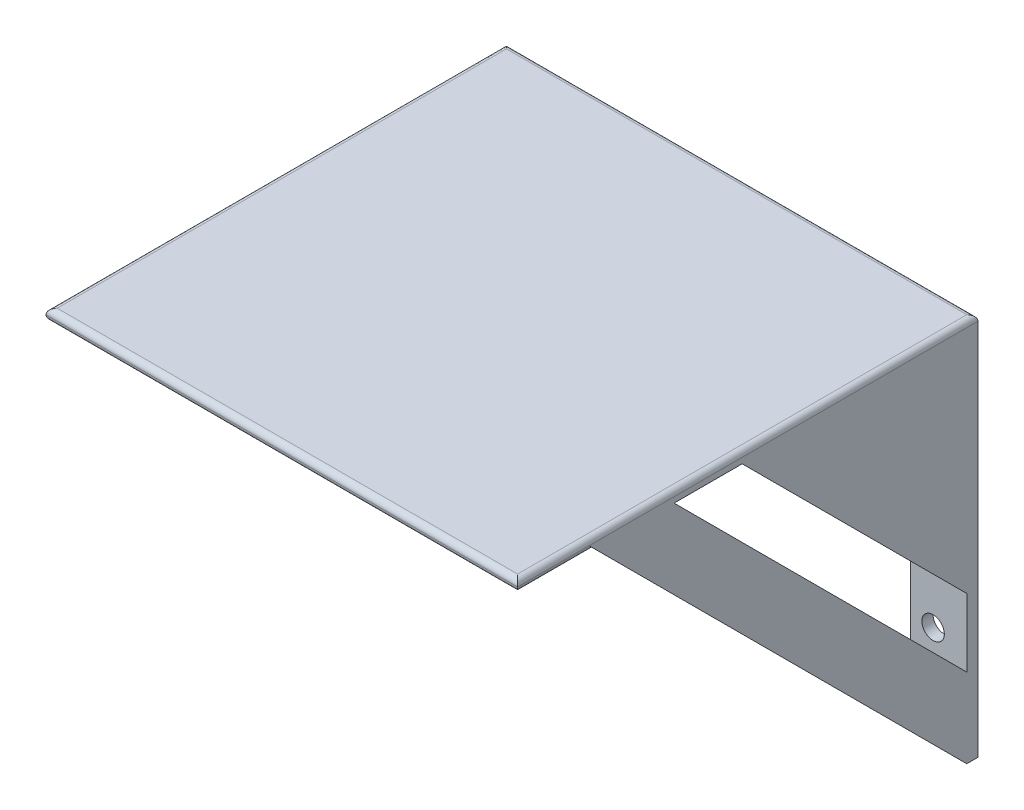
ISO-10303-21;
HEADER;
FILE_DESCRIPTION(('STEP AP214'),'2;1');
FILE_NAME('part.step','',(''),(''),'','','');
FILE_SCHEMA(('AUTOMOTIVE_DESIGN { 1 0 10303 214 1 1 1 1 }'));
ENDSEC;
DATA;
#1=APPLICATION_CONTEXT('core data for automotive mechanical design processes');
#2=APPLICATION_PROTOCOL_DEFINITION('international standard','automotive_design',2000,#1);
#3=PRODUCT_CONTEXT('',#1,'mechanical');
#4=PRODUCT('Part','Part','',(#3));
#5=PRODUCT_RELATED_PRODUCT_CATEGORY('part','',(#4));
#6=PRODUCT_DEFINITION_FORMATION('','',#4);
#7=PRODUCT_DEFINITION_CONTEXT('part definition',#1,'design');
#8=PRODUCT_DEFINITION('design','',#6,#7);
#9=PRODUCT_DEFINITION_SHAPE('','',#8);
#10=(LENGTH_UNIT() NAMED_UNIT(*) SI_UNIT(.MILLI.,.METRE.));
#11=(NAMED_UNIT(*) PLANE_ANGLE_UNIT() SI_UNIT($,.RADIAN.));
#12=(NAMED_UNIT(*) SI_UNIT($,.STERADIAN.) SOLID_ANGLE_UNIT());
#13=UNCERTAINTY_MEASURE_WITH_UNIT(LENGTH_MEASURE(1.E-05),#10,'distance_accuracy_value','');
#14=(GEOMETRIC_REPRESENTATION_CONTEXT(3) GLOBAL_UNCERTAINTY_ASSIGNED_CONTEXT((#13)) GLOBAL_UNIT_ASSIGNED_CONTEXT((#10,
#11,#12)) REPRESENTATION_CONTEXT('',''));
#15=CARTESIAN_POINT('',(0.,0.,0.));
#16=DIRECTION('',(0.,0.,1.));
#17=DIRECTION('',(1.,0.,0.));
#18=AXIS2_PLACEMENT_3D('',#15,#16,#17);
#19=CARTESIAN_POINT('',(0.,0.,3.175));
#20=DIRECTION('',(0.,0.,-1.));
#21=DIRECTION('',(-1.,0.,0.));
#22=AXIS2_PLACEMENT_3D('',#19,#20,#21);
#23=PLANE('',#22);
#24=CARTESIAN_POINT('',(-57.15,-25.612499956,3.175));
#25=DIRECTION('',(0.,0.,1.));
#26=DIRECTION('',(1.,0.,0.));
#27=AXIS2_PLACEMENT_3D('',#24,#25,#26);
#28=CIRCLE('',#27,3.175);
#29=CARTESIAN_POINT('',(-53.975,-25.612499956,3.175));
#30=VERTEX_POINT('',#29);
#31=EDGE_CURVE('E441',#30,#30,#28,.T.);
#32=ORIENTED_EDGE('',*,*,#31,.F.);
#33=EDGE_LOOP('',(#32));
#34=FACE_BOUND('',#33,.T.);
#35=CARTESIAN_POINT('',(-57.15,22.437499956,3.175));
#36=DIRECTION('',(0.,0.,1.));
#37=DIRECTION('',(1.,0.,0.));
#38=AXIS2_PLACEMENT_3D('',#35,#36,#37);
#39=CIRCLE('',#38,3.175);
#40=CARTESIAN_POINT('',(-53.975,22.437499956,3.175));
#41=VERTEX_POINT('',#40);
#42=EDGE_CURVE('E437',#41,#41,#39,.T.);
#43=ORIENTED_EDGE('',*,*,#42,.F.);
#44=EDGE_LOOP('',(#43));
#45=FACE_BOUND('',#44,.T.);
#46=CARTESIAN_POINT('',(-34.925,44.662499956,3.175));
#47=DIRECTION('',(0.,0.,1.));
#48=DIRECTION('',(1.,0.,0.));
#49=AXIS2_PLACEMENT_3D('',#46,#47,#48);
#50=CIRCLE('',#49,3.175);
#51=CARTESIAN_POINT('',(-31.75,44.662499956,3.175));
#52=VERTEX_POINT('',#51);
#53=EDGE_CURVE('E446',#52,#52,#50,.T.);
#54=ORIENTED_EDGE('',*,*,#53,.F.);
#55=EDGE_LOOP('',(#54));
#56=FACE_BOUND('',#55,.T.);
#57=CARTESIAN_POINT('',(34.925,44.662499956,3.175));
#58=DIRECTION('',(0.,0.,1.));
#59=DIRECTION('',(-1.,0.,0.));
#60=AXIS2_PLACEMENT_3D('',#57,#58,#59);
#61=CIRCLE('',#60,3.175);
#62=CARTESIAN_POINT('',(31.75,44.662499956,3.175));
#63=VERTEX_POINT('',#62);
#64=EDGE_CURVE('E454',#63,#63,#61,.T.);
#65=ORIENTED_EDGE('',*,*,#64,.F.);
#66=EDGE_LOOP('',(#65));
#67=FACE_BOUND('',#66,.T.);
#68=CARTESIAN_POINT('',(57.15,22.437499956,3.175));
#69=DIRECTION('',(0.,0.,1.));
#70=DIRECTION('',(-1.,0.,0.));
#71=AXIS2_PLACEMENT_3D('',#68,#69,#70);
#72=CIRCLE('',#71,3.175);
#73=CARTESIAN_POINT('',(53.975,22.437499956,3.175));
#74=VERTEX_POINT('',#73);
#75=EDGE_CURVE('E462',#74,#74,#72,.T.);
#76=ORIENTED_EDGE('',*,*,#75,.F.);
#77=EDGE_LOOP('',(#76));
#78=FACE_BOUND('',#77,.T.);
#79=CARTESIAN_POINT('',(57.15,-25.612499956,3.175));
#80=DIRECTION('',(0.,0.,1.));
#81=DIRECTION('',(-1.,0.,0.));
#82=AXIS2_PLACEMENT_3D('',#79,#80,#81);
#83=CIRCLE('',#82,3.175);
#84=CARTESIAN_POINT('',(53.975,-25.612499956,3.175));
#85=VERTEX_POINT('',#84);
#86=EDGE_CURVE('E470',#85,#85,#83,.T.);
#87=ORIENTED_EDGE('',*,*,#86,.F.);
#88=EDGE_LOOP('',(#87));
#89=FACE_BOUND('',#88,.T.);
#90=DIRECTION('',(0.,1.,0.));
#91=VECTOR('',#90,1.);
#92=CARTESIAN_POINT('',(66.675,-54.187499956,3.175));
#93=LINE('',#92,#91);
#94=CARTESIAN_POINT('',(66.675,-31.7368596533271,3.175));
#95=VERTEX_POINT('',#94);
#96=CARTESIAN_POINT('',(66.675,-12.487500044,3.175));
#97=VERTEX_POINT('',#96);
#98=EDGE_CURVE('E485',#95,#97,#93,.T.);
#99=ORIENTED_EDGE('',*,*,#98,.T.);
#100=DIRECTION('',(1.,0.,0.));
#101=VECTOR('',#100,1.);
#102=CARTESIAN_POINT('',(63.5,-12.487500044,3.175));
#103=LINE('',#102,#101);
#104=CARTESIAN_POINT('',(63.5,-12.487500044,3.175));
#105=VERTEX_POINT('',#104);
#106=EDGE_CURVE('E317',#105,#97,#103,.T.);
#107=ORIENTED_EDGE('',*,*,#106,.F.);
#108=DIRECTION('',(0.,1.,0.));
#109=VECTOR('',#108,1.);
#110=CARTESIAN_POINT('',(63.5,51.012499956,3.175));
#111=LINE('',#110,#109);
#112=CARTESIAN_POINT('',(63.5,51.012499956,3.175));
#113=VERTEX_POINT('',#112);
#114=EDGE_CURVE('E91',#105,#113,#111,.T.);
#115=ORIENTED_EDGE('',*,*,#114,.T.);
#116=DIRECTION('',(1.,0.,0.));
#117=VECTOR('',#116,1.);
#118=CARTESIAN_POINT('',(-66.675,51.012499956,3.175));
#119=LINE('',#118,#117);
#120=CARTESIAN_POINT('',(-63.5,51.012499956,3.175));
#121=VERTEX_POINT('',#120);
#122=EDGE_CURVE('E423',#121,#113,#119,.T.);
#123=ORIENTED_EDGE('',*,*,#122,.F.);
#124=DIRECTION('',(0.,-1.,0.));
#125=VECTOR('',#124,1.);
#126=CARTESIAN_POINT('',(-63.5,-12.487500044,3.175));
#127=LINE('',#126,#125);
#128=CARTESIAN_POINT('',(-63.5,-12.487500044,3.175));
#129=VERTEX_POINT('',#128);
#130=EDGE_CURVE('E405',#121,#129,#127,.T.);
#131=ORIENTED_EDGE('',*,*,#130,.T.);
#132=DIRECTION('',(-1.,0.,0.));
#133=VECTOR('',#132,1.);
#134=CARTESIAN_POINT('',(-63.5,-12.487500044,3.175));
#135=LINE('',#134,#133);
#136=CARTESIAN_POINT('',(-66.675,-12.487500044,3.175));
#137=VERTEX_POINT('',#136);
#138=EDGE_CURVE('E415',#129,#137,#135,.T.);
#139=ORIENTED_EDGE('',*,*,#138,.T.);
#140=DIRECTION('',(0.,-1.,0.));
#141=VECTOR('',#140,1.);
#142=CARTESIAN_POINT('',(-66.675,-54.187499956,3.175));
#143=LINE('',#142,#141);
#144=CARTESIAN_POINT('',(-66.675,-31.7368596533271,3.175));
#145=VERTEX_POINT('',#144);
#146=EDGE_CURVE('E489',#137,#145,#143,.T.);
#147=ORIENTED_EDGE('',*,*,#146,.T.);
#148=DIRECTION('',(-1.,0.,0.));
#149=VECTOR('',#148,1.);
#150=CARTESIAN_POINT('',(-63.5,-31.7368596533271,3.175));
#151=LINE('',#150,#149);
#152=CARTESIAN_POINT('',(-63.5,-31.7368596533271,3.175));
#153=VERTEX_POINT('',#152);
#154=EDGE_CURVE('E369',#153,#145,#151,.T.);
#155=ORIENTED_EDGE('',*,*,#154,.F.);
#156=DIRECTION('',(0.,-1.,0.));
#157=VECTOR('',#156,1.);
#158=CARTESIAN_POINT('',(-63.5,-31.7368596533271,3.175));
#159=LINE('',#158,#157);
#160=CARTESIAN_POINT('',(-63.5,-54.187499956,3.175));
#161=VERTEX_POINT('',#160);
#162=EDGE_CURVE('E390',#153,#161,#159,.T.);
#163=ORIENTED_EDGE('',*,*,#162,.T.);
#164=DIRECTION('',(1.,0.,0.));
#165=VECTOR('',#164,1.);
#166=CARTESIAN_POINT('',(-66.675,-54.187499956,3.175));
#167=LINE('',#166,#165);
#168=CARTESIAN_POINT('',(-50.8,-54.187499956,3.175));
#169=VERTEX_POINT('',#168);
#170=EDGE_CURVE('E493',#161,#169,#167,.T.);
#171=ORIENTED_EDGE('',*,*,#170,.T.);
#172=DIRECTION('',(0.,1.,0.));
#173=VECTOR('',#172,1.);
#174=CARTESIAN_POINT('',(-50.8,-54.187499956,3.175));
#175=LINE('',#174,#173);
#176=CARTESIAN_POINT('',(-50.8,12.912499956,3.175));
#177=VERTEX_POINT('',#176);
#178=EDGE_CURVE('E497',#169,#177,#175,.T.);
#179=ORIENTED_EDGE('',*,*,#178,.T.);
#180=DIRECTION('',(0.707106781186547,0.707106781186548,0.));
#181=VECTOR('',#180,1.);
#182=CARTESIAN_POINT('',(-50.8,12.912499956,3.175));
#183=LINE('',#182,#181);
#184=CARTESIAN_POINT('',(-25.4,38.312499956,3.175));
#185=VERTEX_POINT('',#184);
#186=EDGE_CURVE('E500',#177,#185,#183,.T.);
#187=ORIENTED_EDGE('',*,*,#186,.T.);
#188=DIRECTION('',(1.,0.,0.));
#189=VECTOR('',#188,1.);
#190=CARTESIAN_POINT('',(-25.4,38.312499956,3.175));
#191=LINE('',#190,#189);
#192=CARTESIAN_POINT('',(25.4,38.312499956,3.175));
#193=VERTEX_POINT('',#192);
#194=EDGE_CURVE('E503',#185,#193,#191,.T.);
#195=ORIENTED_EDGE('',*,*,#194,.T.);
#196=DIRECTION('',(0.707106781186548,-0.707106781186547,0.));
#197=VECTOR('',#196,1.);
#198=CARTESIAN_POINT('',(25.4,38.312499956,3.175));
#199=LINE('',#198,#197);
#200=CARTESIAN_POINT('',(50.8,12.912499956,3.175));
#201=VERTEX_POINT('',#200);
#202=EDGE_CURVE('E506',#193,#201,#199,.T.);
#203=ORIENTED_EDGE('',*,*,#202,.T.);
#204=DIRECTION('',(0.,-1.,0.));
#205=VECTOR('',#204,1.);
#206=CARTESIAN_POINT('',(50.8,12.912499956,3.175));
#207=LINE('',#206,#205);
#208=CARTESIAN_POINT('',(50.8,-54.187499956,3.175));
#209=VERTEX_POINT('',#208);
#210=EDGE_CURVE('E509',#201,#209,#207,.T.);
#211=ORIENTED_EDGE('',*,*,#210,.T.);
#212=DIRECTION('',(1.,0.,0.));
#213=VECTOR('',#212,1.);
#214=CARTESIAN_POINT('',(50.8,-54.187499956,3.175));
#215=LINE('',#214,#213);
#216=CARTESIAN_POINT('',(63.5,-54.187499956,3.175));
#217=VERTEX_POINT('',#216);
#218=EDGE_CURVE('E512',#209,#217,#215,.T.);
#219=ORIENTED_EDGE('',*,*,#218,.T.);
#220=DIRECTION('',(0.,1.,0.));
#221=VECTOR('',#220,1.);
#222=CARTESIAN_POINT('',(63.5,-54.187499956,3.175));
#223=LINE('',#222,#221);
#224=CARTESIAN_POINT('',(63.5,-31.7368596533271,3.175));
#225=VERTEX_POINT('',#224);
#226=EDGE_CURVE('E352',#217,#225,#223,.T.);
#227=ORIENTED_EDGE('',*,*,#226,.T.);
#228=DIRECTION('',(1.,0.,0.));
#229=VECTOR('',#228,1.);
#230=CARTESIAN_POINT('',(63.5,-31.7368596533271,3.175));
#231=LINE('',#230,#229);
#232=EDGE_CURVE('E370',#225,#95,#231,.T.);
#233=ORIENTED_EDGE('',*,*,#232,.T.);
#234=EDGE_LOOP('',(#99,#107,#115,#123,#131,#139,#147,#155,#163,#171,#179,#187,#195,#203,#211,
#219,#227,#233));
#235=FACE_BOUND('',#234,.T.);
#236=ADVANCED_FACE('F45',(#34,#45,#56,#67,#78,#89,#235),#23,.F.);
#237=CARTESIAN_POINT('',(66.675,-54.187499956,3.175));
#238=DIRECTION('',(-1.,0.,0.));
#239=DIRECTION('',(0.,0.,1.));
#240=AXIS2_PLACEMENT_3D('',#237,#238,#239);
#241=PLANE('',#240);
#242=ORIENTED_EDGE('',*,*,#98,.F.);
#243=DIRECTION('',(0.,0.707106781186548,0.707106781186547));
#244=VECTOR('',#243,1.);
#245=CARTESIAN_POINT('',(66.675,-31.7368596533271,3.175));
#246=LINE('',#245,#244);
#247=CARTESIAN_POINT('',(66.675,51.012499956,85.9243596093271));
#248=VERTEX_POINT('',#247);
#249=EDGE_CURVE('E348',#95,#248,#246,.T.);
#250=ORIENTED_EDGE('',*,*,#249,.T.);
#251=DIRECTION('',(0.,0.,-1.));
#252=VECTOR('',#251,1.);
#253=CARTESIAN_POINT('',(66.675,51.012499956,130.175));
#254=LINE('',#253,#252);
#255=CARTESIAN_POINT('',(66.675,51.012499956,66.675));
#256=VERTEX_POINT('',#255);
#257=EDGE_CURVE('E429',#248,#256,#254,.T.);
#258=ORIENTED_EDGE('',*,*,#257,.T.);
#259=DIRECTION('',(0.,-0.707106781186548,-0.707106781186548));
#260=VECTOR('',#259,1.);
#261=CARTESIAN_POINT('',(66.675,-12.487500044,3.175));
#262=LINE('',#261,#260);
#263=EDGE_CURVE('E331',#256,#97,#262,.T.);
#264=ORIENTED_EDGE('',*,*,#263,.T.);
#265=EDGE_LOOP('',(#242,#250,#258,#264));
#266=FACE_BOUND('',#265,.T.);
#267=DIRECTION('',(0.,1.,0.));
#268=VECTOR('',#267,1.);
#269=CARTESIAN_POINT('',(66.675,-54.187499956,0.));
#270=LINE('',#269,#268);
#271=CARTESIAN_POINT('',(66.675,-54.187499956,0.));
#272=VERTEX_POINT('',#271);
#273=CARTESIAN_POINT('',(66.675,52.599999956,0.));
#274=VERTEX_POINT('',#273);
#275=EDGE_CURVE('E481',#272,#274,#270,.T.);
#276=ORIENTED_EDGE('',*,*,#275,.T.);
#277=DIRECTION('',(0.,0.,-1.));
#278=VECTOR('',#277,1.);
#279=CARTESIAN_POINT('',(66.675,52.599999956,3.175));
#280=LINE('',#279,#278);
#281=CARTESIAN_POINT('',(66.675,52.599999956,109.962499912));
#282=VERTEX_POINT('',#281);
#283=EDGE_CURVE('E264',#274,#282,#280,.F.);
#284=ORIENTED_EDGE('',*,*,#283,.T.);
#285=DIRECTION('',(0.,-0.707106781186548,-0.707106781186548));
#286=VECTOR('',#285,1.);
#287=CARTESIAN_POINT('',(66.675,51.012499956,108.374999912));
#288=LINE('',#287,#286);
#289=CARTESIAN_POINT('',(66.675,-54.187499956,3.175));
#290=VERTEX_POINT('',#289);
#291=EDGE_CURVE('E334',#282,#290,#288,.T.);
#292=ORIENTED_EDGE('',*,*,#291,.T.);
#293=DIRECTION('',(0.,0.,-1.));
#294=VECTOR('',#293,1.);
#295=CARTESIAN_POINT('',(66.675,-54.187499956,3.175));
#296=LINE('',#295,#294);
#297=EDGE_CURVE('E516',#290,#272,#296,.T.);
#298=ORIENTED_EDGE('',*,*,#297,.T.);
#299=EDGE_LOOP('',(#276,#284,#292,#298));
#300=FACE_BOUND('',#299,.T.);
#301=ADVANCED_FACE('F594',(#266,#300),#241,.F.);
#302=CARTESIAN_POINT('',(-66.675,54.187499956,3.175));
#303=DIRECTION('',(0.,-1.,0.));
#304=DIRECTION('',(0.,0.,-1.));
#305=AXIS2_PLACEMENT_3D('',#302,#303,#304);
#306=PLANE('',#305);
#307=DIRECTION('',(-1.,0.,0.));
#308=VECTOR('',#307,1.);
#309=CARTESIAN_POINT('',(66.675,54.187499956,128.5875));
#310=LINE('',#309,#308);
#311=CARTESIAN_POINT('',(-65.0875,54.187499956,128.5875));
#312=VERTEX_POINT('',#311);
#313=CARTESIAN_POINT('',(65.0875,54.187499956,128.5875));
#314=VERTEX_POINT('',#313);
#315=EDGE_CURVE('E314',#312,#314,#310,.F.);
#316=ORIENTED_EDGE('',*,*,#315,.T.);
#317=DIRECTION('',(0.,0.,-1.));
#318=VECTOR('',#317,1.);
#319=CARTESIAN_POINT('',(65.0875,54.187499956,3.175));
#320=LINE('',#319,#318);
#321=CARTESIAN_POINT('',(65.0875,54.187499956,1.5875));
#322=VERTEX_POINT('',#321);
#323=EDGE_CURVE('E270',#314,#322,#320,.T.);
#324=ORIENTED_EDGE('',*,*,#323,.T.);
#325=DIRECTION('',(-1.,0.,0.));
#326=VECTOR('',#325,1.);
#327=CARTESIAN_POINT('',(-66.675,54.187499956,1.5875));
#328=LINE('',#327,#326);
#329=CARTESIAN_POINT('',(-65.0875,54.187499956,1.5875));
#330=VERTEX_POINT('',#329);
#331=EDGE_CURVE('E574',#322,#330,#328,.T.);
#332=ORIENTED_EDGE('',*,*,#331,.T.);
#333=DIRECTION('',(0.,0.,-1.));
#334=VECTOR('',#333,1.);
#335=CARTESIAN_POINT('',(-65.0875,54.187499956,3.175));
#336=LINE('',#335,#334);
#337=EDGE_CURVE('E577',#330,#312,#336,.F.);
#338=ORIENTED_EDGE('',*,*,#337,.T.);
#339=EDGE_LOOP('',(#316,#324,#332,#338));
#340=FACE_BOUND('',#339,.T.);
#341=ADVANCED_FACE('F583',(#340),#306,.F.);
#342=CARTESIAN_POINT('',(-66.675,-54.187499956,3.175));
#343=DIRECTION('',(1.,0.,0.));
#344=DIRECTION('',(0.,0.,-1.));
#345=AXIS2_PLACEMENT_3D('',#342,#343,#344);
#346=PLANE('',#345);
#347=DIRECTION('',(0.,0.707106781186548,0.707106781186548));
#348=VECTOR('',#347,1.);
#349=CARTESIAN_POINT('',(-66.675,51.012499956,108.374999912));
#350=LINE('',#349,#348);
#351=CARTESIAN_POINT('',(-66.675,-54.187499956,3.175));
#352=VERTEX_POINT('',#351);
#353=CARTESIAN_POINT('',(-66.675,52.599999956,109.962499912));
#354=VERTEX_POINT('',#353);
#355=EDGE_CURVE('E389',#352,#354,#350,.T.);
#356=ORIENTED_EDGE('',*,*,#355,.T.);
#357=DIRECTION('',(0.,0.,-1.));
#358=VECTOR('',#357,1.);
#359=CARTESIAN_POINT('',(-66.675,52.599999956,3.175));
#360=LINE('',#359,#358);
#361=CARTESIAN_POINT('',(-66.675,52.599999956,0.));
#362=VERTEX_POINT('',#361);
#363=EDGE_CURVE('E255',#354,#362,#360,.T.);
#364=ORIENTED_EDGE('',*,*,#363,.T.);
#365=DIRECTION('',(0.,-1.,0.));
#366=VECTOR('',#365,1.);
#367=CARTESIAN_POINT('',(-66.675,-54.187499956,0.));
#368=LINE('',#367,#366);
#369=CARTESIAN_POINT('',(-66.675,-54.187499956,0.));
#370=VERTEX_POINT('',#369);
#371=EDGE_CURVE('E520',#362,#370,#368,.T.);
#372=ORIENTED_EDGE('',*,*,#371,.T.);
#373=DIRECTION('',(0.,0.,-1.));
#374=VECTOR('',#373,1.);
#375=CARTESIAN_POINT('',(-66.675,-54.187499956,3.175));
#376=LINE('',#375,#374);
#377=EDGE_CURVE('E570',#352,#370,#376,.T.);
#378=ORIENTED_EDGE('',*,*,#377,.F.);
#379=EDGE_LOOP('',(#356,#364,#372,#378));
#380=FACE_BOUND('',#379,.T.);
#381=ORIENTED_EDGE('',*,*,#146,.F.);
#382=DIRECTION('',(0.,0.707106781186548,0.707106781186548));
#383=VECTOR('',#382,1.);
#384=CARTESIAN_POINT('',(-66.675,-12.487500044,3.175));
#385=LINE('',#384,#383);
#386=CARTESIAN_POINT('',(-66.675,51.012499956,66.675));
#387=VERTEX_POINT('',#386);
#388=EDGE_CURVE('E393',#137,#387,#385,.T.);
#389=ORIENTED_EDGE('',*,*,#388,.T.);
#390=DIRECTION('',(0.,0.,-1.));
#391=VECTOR('',#390,1.);
#392=CARTESIAN_POINT('',(-66.675,51.012499956,130.175));
#393=LINE('',#392,#391);
#394=CARTESIAN_POINT('',(-66.675,51.012499956,85.9243596093271));
#395=VERTEX_POINT('',#394);
#396=EDGE_CURVE('E433',#395,#387,#393,.T.);
#397=ORIENTED_EDGE('',*,*,#396,.F.);
#398=DIRECTION('',(0.,-0.707106781186548,-0.707106781186547));
#399=VECTOR('',#398,1.);
#400=CARTESIAN_POINT('',(-66.675,-31.7368596533271,3.175));
#401=LINE('',#400,#399);
#402=EDGE_CURVE('E385',#395,#145,#401,.T.);
#403=ORIENTED_EDGE('',*,*,#402,.T.);
#404=EDGE_LOOP('',(#381,#389,#397,#403));
#405=FACE_BOUND('',#404,.T.);
#406=ADVANCED_FACE('F628',(#380,#405),#346,.F.);
#407=CARTESIAN_POINT('',(-66.675,-54.187499956,3.175));
#408=DIRECTION('',(0.,1.,0.));
#409=DIRECTION('',(-1.,0.,0.));
#410=AXIS2_PLACEMENT_3D('',#407,#408,#409);
#411=PLANE('',#410);
#412=DIRECTION('',(1.,0.,0.));
#413=VECTOR('',#412,1.);
#414=CARTESIAN_POINT('',(-66.675,-54.187499956,0.));
#415=LINE('',#414,#413);
#416=CARTESIAN_POINT('',(-50.8,-54.187499956,0.));
#417=VERTEX_POINT('',#416);
#418=EDGE_CURVE('E523',#370,#417,#415,.T.);
#419=ORIENTED_EDGE('',*,*,#418,.T.);
#420=DIRECTION('',(0.,0.,-1.));
#421=VECTOR('',#420,1.);
#422=CARTESIAN_POINT('',(-50.8,-54.187499956,3.175));
#423=LINE('',#422,#421);
#424=EDGE_CURVE('E566',#169,#417,#423,.T.);
#425=ORIENTED_EDGE('',*,*,#424,.F.);
#426=ORIENTED_EDGE('',*,*,#170,.F.);
#427=EDGE_CURVE('E494',#352,#161,#167,.T.);
#428=ORIENTED_EDGE('',*,*,#427,.F.);
#429=ORIENTED_EDGE('',*,*,#377,.T.);
#430=EDGE_LOOP('',(#419,#425,#426,#428,#429));
#431=FACE_BOUND('',#430,.T.);
#432=ADVANCED_FACE('F685',(#431),#411,.F.);
#433=CARTESIAN_POINT('',(-50.8,-54.187499956,3.175));
#434=DIRECTION('',(-1.,0.,0.));
#435=DIRECTION('',(0.,0.,1.));
#436=AXIS2_PLACEMENT_3D('',#433,#434,#435);
#437=PLANE('',#436);
#438=DIRECTION('',(0.,1.,0.));
#439=VECTOR('',#438,1.);
#440=CARTESIAN_POINT('',(-50.8,-54.187499956,0.));
#441=LINE('',#440,#439);
#442=CARTESIAN_POINT('',(-50.8,12.912499956,0.));
#443=VERTEX_POINT('',#442);
#444=EDGE_CURVE('E526',#417,#443,#441,.T.);
#445=ORIENTED_EDGE('',*,*,#444,.T.);
#446=DIRECTION('',(0.,0.,-1.));
#447=VECTOR('',#446,1.);
#448=CARTESIAN_POINT('',(-50.8,12.912499956,3.175));
#449=LINE('',#448,#447);
#450=EDGE_CURVE('E562',#177,#443,#449,.T.);
#451=ORIENTED_EDGE('',*,*,#450,.F.);
#452=ORIENTED_EDGE('',*,*,#178,.F.);
#453=ORIENTED_EDGE('',*,*,#424,.T.);
#454=EDGE_LOOP('',(#445,#451,#452,#453));
#455=FACE_BOUND('',#454,.T.);
#456=ADVANCED_FACE('F681',(#455),#437,.F.);
#457=CARTESIAN_POINT('',(-50.8,12.912499956,3.175));
#458=DIRECTION('',(-0.707106781186548,0.707106781186547,0.));
#459=DIRECTION('',(-0.707106781186547,-0.707106781186548,0.));
#460=AXIS2_PLACEMENT_3D('',#457,#458,#459);
#461=PLANE('',#460);
#462=DIRECTION('',(0.707106781186547,0.707106781186548,0.));
#463=VECTOR('',#462,1.);
#464=CARTESIAN_POINT('',(-50.8,12.912499956,0.));
#465=LINE('',#464,#463);
#466=CARTESIAN_POINT('',(-25.4,38.312499956,0.));
#467=VERTEX_POINT('',#466);
#468=EDGE_CURVE('E529',#443,#467,#465,.T.);
#469=ORIENTED_EDGE('',*,*,#468,.T.);
#470=DIRECTION('',(0.,0.,-1.));
#471=VECTOR('',#470,1.);
#472=CARTESIAN_POINT('',(-25.4,38.312499956,3.175));
#473=LINE('',#472,#471);
#474=EDGE_CURVE('E558',#185,#467,#473,.T.);
#475=ORIENTED_EDGE('',*,*,#474,.F.);
#476=ORIENTED_EDGE('',*,*,#186,.F.);
#477=ORIENTED_EDGE('',*,*,#450,.T.);
#478=EDGE_LOOP('',(#469,#475,#476,#477));
#479=FACE_BOUND('',#478,.T.);
#480=ADVANCED_FACE('F677',(#479),#461,.F.);
#481=CARTESIAN_POINT('',(-25.4,38.312499956,3.175));
#482=DIRECTION('',(0.,1.,0.));
#483=DIRECTION('',(0.,0.,1.));
#484=AXIS2_PLACEMENT_3D('',#481,#482,#483);
#485=PLANE('',#484);
#486=DIRECTION('',(1.,0.,0.));
#487=VECTOR('',#486,1.);
#488=CARTESIAN_POINT('',(-25.4,38.312499956,0.));
#489=LINE('',#488,#487);
#490=CARTESIAN_POINT('',(25.4,38.312499956,0.));
#491=VERTEX_POINT('',#490);
#492=EDGE_CURVE('E532',#467,#491,#489,.T.);
#493=ORIENTED_EDGE('',*,*,#492,.T.);
#494=DIRECTION('',(0.,0.,-1.));
#495=VECTOR('',#494,1.);
#496=CARTESIAN_POINT('',(25.4,38.312499956,3.175));
#497=LINE('',#496,#495);
#498=EDGE_CURVE('E554',#193,#491,#497,.T.);
#499=ORIENTED_EDGE('',*,*,#498,.F.);
#500=ORIENTED_EDGE('',*,*,#194,.F.);
#501=ORIENTED_EDGE('',*,*,#474,.T.);
#502=EDGE_LOOP('',(#493,#499,#500,#501));
#503=FACE_BOUND('',#502,.T.);
#504=ADVANCED_FACE('F673',(#503),#485,.F.);
#505=CARTESIAN_POINT('',(25.4,38.312499956,3.175));
#506=DIRECTION('',(0.707106781186547,0.707106781186548,0.));
#507=DIRECTION('',(-0.707106781186548,0.707106781186547,0.));
#508=AXIS2_PLACEMENT_3D('',#505,#506,#507);
#509=PLANE('',#508);
#510=DIRECTION('',(0.707106781186548,-0.707106781186547,0.));
#511=VECTOR('',#510,1.);
#512=CARTESIAN_POINT('',(25.4,38.312499956,0.));
#513=LINE('',#512,#511);
#514=CARTESIAN_POINT('',(50.8,12.912499956,0.));
#515=VERTEX_POINT('',#514);
#516=EDGE_CURVE('E535',#491,#515,#513,.T.);
#517=ORIENTED_EDGE('',*,*,#516,.T.);
#518=DIRECTION('',(0.,0.,-1.));
#519=VECTOR('',#518,1.);
#520=CARTESIAN_POINT('',(50.8,12.912499956,3.175));
#521=LINE('',#520,#519);
#522=EDGE_CURVE('E550',#201,#515,#521,.T.);
#523=ORIENTED_EDGE('',*,*,#522,.F.);
#524=ORIENTED_EDGE('',*,*,#202,.F.);
#525=ORIENTED_EDGE('',*,*,#498,.T.);
#526=EDGE_LOOP('',(#517,#523,#524,#525));
#527=FACE_BOUND('',#526,.T.);
#528=ADVANCED_FACE('F669',(#527),#509,.F.);
#529=CARTESIAN_POINT('',(50.8,12.912499956,3.175));
#530=DIRECTION('',(1.,0.,0.));
#531=DIRECTION('',(0.,1.,0.));
#532=AXIS2_PLACEMENT_3D('',#529,#530,#531);
#533=PLANE('',#532);
#534=DIRECTION('',(0.,-1.,0.));
#535=VECTOR('',#534,1.);
#536=CARTESIAN_POINT('',(50.8,12.912499956,0.));
#537=LINE('',#536,#535);
#538=CARTESIAN_POINT('',(50.8,-54.187499956,0.));
#539=VERTEX_POINT('',#538);
#540=EDGE_CURVE('E538',#515,#539,#537,.T.);
#541=ORIENTED_EDGE('',*,*,#540,.T.);
#542=DIRECTION('',(0.,0.,-1.));
#543=VECTOR('',#542,1.);
#544=CARTESIAN_POINT('',(50.8,-54.187499956,3.175));
#545=LINE('',#544,#543);
#546=EDGE_CURVE('E546',#209,#539,#545,.T.);
#547=ORIENTED_EDGE('',*,*,#546,.F.);
#548=ORIENTED_EDGE('',*,*,#210,.F.);
#549=ORIENTED_EDGE('',*,*,#522,.T.);
#550=EDGE_LOOP('',(#541,#547,#548,#549));
#551=FACE_BOUND('',#550,.T.);
#552=ADVANCED_FACE('F666',(#551),#533,.F.);
#553=CARTESIAN_POINT('',(50.8,-54.187499956,3.175));
#554=DIRECTION('',(0.,1.,0.));
#555=DIRECTION('',(-1.,0.,0.));
#556=AXIS2_PLACEMENT_3D('',#553,#554,#555);
#557=PLANE('',#556);
#558=DIRECTION('',(1.,0.,0.));
#559=VECTOR('',#558,1.);
#560=CARTESIAN_POINT('',(50.8,-54.187499956,0.));
#561=LINE('',#560,#559);
#562=EDGE_CURVE('E490',#539,#272,#561,.T.);
#563=ORIENTED_EDGE('',*,*,#562,.T.);
#564=ORIENTED_EDGE('',*,*,#297,.F.);
#565=DIRECTION('',(1.,0.,0.));
#566=VECTOR('',#565,1.);
#567=CARTESIAN_POINT('',(63.5,-54.187499956,3.175));
#568=LINE('',#567,#566);
#569=EDGE_CURVE('E373',#217,#290,#568,.T.);
#570=ORIENTED_EDGE('',*,*,#569,.F.);
#571=ORIENTED_EDGE('',*,*,#218,.F.);
#572=ORIENTED_EDGE('',*,*,#546,.T.);
#573=EDGE_LOOP('',(#563,#564,#570,#571,#572));
#574=FACE_BOUND('',#573,.T.);
#575=ADVANCED_FACE('F596',(#574),#557,.F.);
#576=CARTESIAN_POINT('',(0.,0.,0.));
#577=DIRECTION('',(0.,0.,-1.));
#578=DIRECTION('',(-1.,0.,0.));
#579=AXIS2_PLACEMENT_3D('',#576,#577,#578);
#580=PLANE('',#579);
#581=CARTESIAN_POINT('',(57.15,-25.612499956,0.));
#582=DIRECTION('',(0.,0.,1.));
#583=DIRECTION('',(-1.,0.,0.));
#584=AXIS2_PLACEMENT_3D('',#581,#582,#583);
#585=CIRCLE('',#584,3.175);
#586=CARTESIAN_POINT('',(53.975,-25.612499956,0.));
#587=VERTEX_POINT('',#586);
#588=EDGE_CURVE('E436',#587,#587,#585,.T.);
#589=ORIENTED_EDGE('',*,*,#588,.T.);
#590=EDGE_LOOP('',(#589));
#591=FACE_BOUND('',#590,.T.);
#592=CARTESIAN_POINT('',(57.15,22.437499956,0.));
#593=DIRECTION('',(0.,0.,1.));
#594=DIRECTION('',(-1.,0.,0.));
#595=AXIS2_PLACEMENT_3D('',#592,#593,#594);
#596=CIRCLE('',#595,3.175);
#597=CARTESIAN_POINT('',(53.975,22.437499956,0.));
#598=VERTEX_POINT('',#597);
#599=EDGE_CURVE('E466',#598,#598,#596,.T.);
#600=ORIENTED_EDGE('',*,*,#599,.T.);
#601=EDGE_LOOP('',(#600));
#602=FACE_BOUND('',#601,.T.);
#603=CARTESIAN_POINT('',(34.925,44.662499956,0.));
#604=DIRECTION('',(0.,0.,1.));
#605=DIRECTION('',(-1.,0.,0.));
#606=AXIS2_PLACEMENT_3D('',#603,#604,#605);
#607=CIRCLE('',#606,3.175);
#608=CARTESIAN_POINT('',(31.75,44.662499956,0.));
#609=VERTEX_POINT('',#608);
#610=EDGE_CURVE('E458',#609,#609,#607,.T.);
#611=ORIENTED_EDGE('',*,*,#610,.T.);
#612=EDGE_LOOP('',(#611));
#613=FACE_BOUND('',#612,.T.);
#614=CARTESIAN_POINT('',(-34.925,44.662499956,0.));
#615=DIRECTION('',(0.,0.,1.));
#616=DIRECTION('',(1.,0.,0.));
#617=AXIS2_PLACEMENT_3D('',#614,#615,#616);
#618=CIRCLE('',#617,3.175);
#619=CARTESIAN_POINT('',(-31.75,44.662499956,0.));
#620=VERTEX_POINT('',#619);
#621=EDGE_CURVE('E450',#620,#620,#618,.T.);
#622=ORIENTED_EDGE('',*,*,#621,.T.);
#623=EDGE_LOOP('',(#622));
#624=FACE_BOUND('',#623,.T.);
#625=CARTESIAN_POINT('',(-57.15,22.437499956,0.));
#626=DIRECTION('',(0.,0.,1.));
#627=DIRECTION('',(1.,0.,0.));
#628=AXIS2_PLACEMENT_3D('',#625,#626,#627);
#629=CIRCLE('',#628,3.175);
#630=CARTESIAN_POINT('',(-53.975,22.437499956,0.));
#631=VERTEX_POINT('',#630);
#632=EDGE_CURVE('E442',#631,#631,#629,.T.);
#633=ORIENTED_EDGE('',*,*,#632,.T.);
#634=EDGE_LOOP('',(#633));
#635=FACE_BOUND('',#634,.T.);
#636=CARTESIAN_POINT('',(-57.15,-25.612499956,0.));
#637=DIRECTION('',(0.,0.,1.));
#638=DIRECTION('',(1.,0.,0.));
#639=AXIS2_PLACEMENT_3D('',#636,#637,#638);
#640=CIRCLE('',#639,3.175);
#641=CARTESIAN_POINT('',(-53.975,-25.612499956,0.));
#642=VERTEX_POINT('',#641);
#643=EDGE_CURVE('E477',#642,#642,#640,.T.);
#644=ORIENTED_EDGE('',*,*,#643,.T.);
#645=EDGE_LOOP('',(#644));
#646=FACE_BOUND('',#645,.T.);
#647=ORIENTED_EDGE('',*,*,#371,.F.);
#648=DIRECTION('',(-1.,0.,0.));
#649=VECTOR('',#648,1.);
#650=CARTESIAN_POINT('',(66.675,52.599999956,0.));
#651=LINE('',#650,#649);
#652=EDGE_CURVE('E236',#362,#274,#651,.F.);
#653=ORIENTED_EDGE('',*,*,#652,.T.);
#654=ORIENTED_EDGE('',*,*,#275,.F.);
#655=ORIENTED_EDGE('',*,*,#562,.F.);
#656=ORIENTED_EDGE('',*,*,#540,.F.);
#657=ORIENTED_EDGE('',*,*,#516,.F.);
#658=ORIENTED_EDGE('',*,*,#492,.F.);
#659=ORIENTED_EDGE('',*,*,#468,.F.);
#660=ORIENTED_EDGE('',*,*,#444,.F.);
#661=ORIENTED_EDGE('',*,*,#418,.F.);
#662=EDGE_LOOP('',(#647,#653,#654,#655,#656,#657,#658,#659,#660,#661));
#663=FACE_BOUND('',#662,.T.);
#664=ADVANCED_FACE('F590',(#591,#602,#613,#624,#635,#646,#663),#580,.T.);
#665=CARTESIAN_POINT('',(-57.15,-25.612499956,0.));
#666=DIRECTION('',(0.,0.,1.));
#667=DIRECTION('',(1.,0.,0.));
#668=AXIS2_PLACEMENT_3D('',#665,#666,#667);
#669=CYLINDRICAL_SURFACE('',#668,3.175);
#670=ORIENTED_EDGE('',*,*,#643,.F.);
#671=EDGE_LOOP('',(#670));
#672=FACE_BOUND('',#671,.T.);
#673=ORIENTED_EDGE('',*,*,#31,.T.);
#674=EDGE_LOOP('',(#673));
#675=FACE_BOUND('',#674,.T.);
#676=ADVANCED_FACE('F660',(#672,#675),#669,.F.);
#677=CARTESIAN_POINT('',(-57.15,22.437499956,0.));
#678=DIRECTION('',(0.,0.,1.));
#679=DIRECTION('',(1.,0.,0.));
#680=AXIS2_PLACEMENT_3D('',#677,#678,#679);
#681=CYLINDRICAL_SURFACE('',#680,3.175);
#682=ORIENTED_EDGE('',*,*,#632,.F.);
#683=EDGE_LOOP('',(#682));
#684=FACE_BOUND('',#683,.T.);
#685=ORIENTED_EDGE('',*,*,#42,.T.);
#686=EDGE_LOOP('',(#685));
#687=FACE_BOUND('',#686,.T.);
#688=ADVANCED_FACE('F730',(#684,#687),#681,.F.);
#689=CARTESIAN_POINT('',(-34.925,44.662499956,0.));
#690=DIRECTION('',(0.,0.,1.));
#691=DIRECTION('',(1.,0.,0.));
#692=AXIS2_PLACEMENT_3D('',#689,#690,#691);
#693=CYLINDRICAL_SURFACE('',#692,3.175);
#694=ORIENTED_EDGE('',*,*,#621,.F.);
#695=EDGE_LOOP('',(#694));
#696=FACE_BOUND('',#695,.T.);
#697=ORIENTED_EDGE('',*,*,#53,.T.);
#698=EDGE_LOOP('',(#697));
#699=FACE_BOUND('',#698,.T.);
#700=ADVANCED_FACE('F733',(#696,#699),#693,.F.);
#701=CARTESIAN_POINT('',(34.925,44.662499956,0.));
#702=DIRECTION('',(0.,0.,1.));
#703=DIRECTION('',(1.,0.,0.));
#704=AXIS2_PLACEMENT_3D('',#701,#702,#703);
#705=CYLINDRICAL_SURFACE('',#704,3.175);
#706=ORIENTED_EDGE('',*,*,#610,.F.);
#707=EDGE_LOOP('',(#706));
#708=FACE_BOUND('',#707,.T.);
#709=ORIENTED_EDGE('',*,*,#64,.T.);
#710=EDGE_LOOP('',(#709));
#711=FACE_BOUND('',#710,.T.);
#712=ADVANCED_FACE('F737',(#708,#711),#705,.F.);
#713=CARTESIAN_POINT('',(57.15,22.437499956,0.));
#714=DIRECTION('',(0.,0.,1.));
#715=DIRECTION('',(1.,0.,0.));
#716=AXIS2_PLACEMENT_3D('',#713,#714,#715);
#717=CYLINDRICAL_SURFACE('',#716,3.175);
#718=ORIENTED_EDGE('',*,*,#599,.F.);
#719=EDGE_LOOP('',(#718));
#720=FACE_BOUND('',#719,.T.);
#721=ORIENTED_EDGE('',*,*,#75,.T.);
#722=EDGE_LOOP('',(#721));
#723=FACE_BOUND('',#722,.T.);
#724=ADVANCED_FACE('F741',(#720,#723),#717,.F.);
#725=CARTESIAN_POINT('',(57.15,-25.612499956,0.));
#726=DIRECTION('',(0.,0.,1.));
#727=DIRECTION('',(1.,0.,0.));
#728=AXIS2_PLACEMENT_3D('',#725,#726,#727);
#729=CYLINDRICAL_SURFACE('',#728,3.175);
#730=ORIENTED_EDGE('',*,*,#588,.F.);
#731=EDGE_LOOP('',(#730));
#732=FACE_BOUND('',#731,.T.);
#733=ORIENTED_EDGE('',*,*,#86,.T.);
#734=EDGE_LOOP('',(#733));
#735=FACE_BOUND('',#734,.T.);
#736=ADVANCED_FACE('F729',(#732,#735),#729,.F.);
#737=CARTESIAN_POINT('',(-66.675,51.012499956,130.175));
#738=DIRECTION('',(0.,1.,0.));
#739=DIRECTION('',(0.,0.,1.));
#740=AXIS2_PLACEMENT_3D('',#737,#738,#739);
#741=PLANE('',#740);
#742=DIRECTION('',(1.,0.,0.));
#743=VECTOR('',#742,1.);
#744=CARTESIAN_POINT('',(63.5,51.012499956,108.374999912));
#745=LINE('',#744,#743);
#746=CARTESIAN_POINT('',(63.5,51.012499956,108.374999912));
#747=VERTEX_POINT('',#746);
#748=CARTESIAN_POINT('',(65.0875,51.012499956,108.374999912));
#749=VERTEX_POINT('',#748);
#750=EDGE_CURVE('E359',#747,#749,#745,.T.);
#751=ORIENTED_EDGE('',*,*,#750,.T.);
#752=DIRECTION('',(0.,0.,-1.));
#753=VECTOR('',#752,1.);
#754=CARTESIAN_POINT('',(65.0875,51.012499956,130.175));
#755=LINE('',#754,#753);
#756=CARTESIAN_POINT('',(65.0875,51.012499956,128.5875));
#757=VERTEX_POINT('',#756);
#758=EDGE_CURVE('E65',#749,#757,#755,.F.);
#759=ORIENTED_EDGE('',*,*,#758,.T.);
#760=DIRECTION('',(1.,0.,0.));
#761=VECTOR('',#760,1.);
#762=CARTESIAN_POINT('',(-66.675,51.012499956,128.5875));
#763=LINE('',#762,#761);
#764=CARTESIAN_POINT('',(-65.0875,51.012499956,128.5875));
#765=VERTEX_POINT('',#764);
#766=EDGE_CURVE('E233',#757,#765,#763,.F.);
#767=ORIENTED_EDGE('',*,*,#766,.T.);
#768=DIRECTION('',(0.,0.,-1.));
#769=VECTOR('',#768,1.);
#770=CARTESIAN_POINT('',(-65.0875,51.012499956,130.175));
#771=LINE('',#770,#769);
#772=CARTESIAN_POINT('',(-65.0875,51.012499956,108.374999912));
#773=VERTEX_POINT('',#772);
#774=EDGE_CURVE('E228',#765,#773,#771,.T.);
#775=ORIENTED_EDGE('',*,*,#774,.T.);
#776=DIRECTION('',(-1.,0.,0.));
#777=VECTOR('',#776,1.);
#778=CARTESIAN_POINT('',(-63.5,51.012499956,108.374999912));
#779=LINE('',#778,#777);
#780=CARTESIAN_POINT('',(-63.5,51.012499956,108.374999912));
#781=VERTEX_POINT('',#780);
#782=EDGE_CURVE('E231',#781,#773,#779,.T.);
#783=ORIENTED_EDGE('',*,*,#782,.F.);
#784=DIRECTION('',(0.,0.,-1.));
#785=VECTOR('',#784,1.);
#786=CARTESIAN_POINT('',(-63.5,51.012499956,85.9243596093271));
#787=LINE('',#786,#785);
#788=CARTESIAN_POINT('',(-63.5,51.012499956,85.9243596093271));
#789=VERTEX_POINT('',#788);
#790=EDGE_CURVE('E397',#781,#789,#787,.T.);
#791=ORIENTED_EDGE('',*,*,#790,.T.);
#792=DIRECTION('',(-1.,0.,0.));
#793=VECTOR('',#792,1.);
#794=CARTESIAN_POINT('',(-63.5,51.012499956,85.9243596093271));
#795=LINE('',#794,#793);
#796=EDGE_CURVE('E247',#789,#395,#795,.T.);
#797=ORIENTED_EDGE('',*,*,#796,.T.);
#798=ORIENTED_EDGE('',*,*,#396,.T.);
#799=DIRECTION('',(-1.,0.,0.));
#800=VECTOR('',#799,1.);
#801=CARTESIAN_POINT('',(-63.5,51.012499956,66.675));
#802=LINE('',#801,#800);
#803=CARTESIAN_POINT('',(-63.5,51.012499956,66.675));
#804=VERTEX_POINT('',#803);
#805=EDGE_CURVE('E419',#804,#387,#802,.T.);
#806=ORIENTED_EDGE('',*,*,#805,.F.);
#807=DIRECTION('',(0.,0.,-1.));
#808=VECTOR('',#807,1.);
#809=CARTESIAN_POINT('',(-63.5,51.012499956,3.175));
#810=LINE('',#809,#808);
#811=EDGE_CURVE('E412',#804,#121,#810,.T.);
#812=ORIENTED_EDGE('',*,*,#811,.T.);
#813=ORIENTED_EDGE('',*,*,#122,.T.);
#814=DIRECTION('',(0.,0.,1.));
#815=VECTOR('',#814,1.);
#816=CARTESIAN_POINT('',(63.5,51.012499956,66.675));
#817=LINE('',#816,#815);
#818=CARTESIAN_POINT('',(63.5,51.012499956,66.675));
#819=VERTEX_POINT('',#818);
#820=EDGE_CURVE('E337',#113,#819,#817,.T.);
#821=ORIENTED_EDGE('',*,*,#820,.T.);
#822=DIRECTION('',(1.,0.,0.));
#823=VECTOR('',#822,1.);
#824=CARTESIAN_POINT('',(63.5,51.012499956,66.675));
#825=LINE('',#824,#823);
#826=EDGE_CURVE('E320',#819,#256,#825,.T.);
#827=ORIENTED_EDGE('',*,*,#826,.T.);
#828=ORIENTED_EDGE('',*,*,#257,.F.);
#829=DIRECTION('',(1.,0.,0.));
#830=VECTOR('',#829,1.);
#831=CARTESIAN_POINT('',(63.5,51.012499956,85.9243596093271));
#832=LINE('',#831,#830);
#833=CARTESIAN_POINT('',(63.5,51.012499956,85.9243596093271));
#834=VERTEX_POINT('',#833);
#835=EDGE_CURVE('E365',#834,#248,#832,.T.);
#836=ORIENTED_EDGE('',*,*,#835,.F.);
#837=DIRECTION('',(0.,0.,1.));
#838=VECTOR('',#837,1.);
#839=CARTESIAN_POINT('',(63.5,51.012499956,85.9243596093271));
#840=LINE('',#839,#838);
#841=EDGE_CURVE('E343',#834,#747,#840,.T.);
#842=ORIENTED_EDGE('',*,*,#841,.T.);
#843=EDGE_LOOP('',(#751,#759,#767,#775,#783,#791,#797,#798,#806,#812,#813,#821,#827,#828,#836,#842));
#844=FACE_BOUND('',#843,.T.);
#845=ADVANCED_FACE('F230',(#844),#741,.F.);
#846=CARTESIAN_POINT('',(-63.5,-12.487500044,3.175));
#847=DIRECTION('',(0.,-0.707106781186548,0.707106781186548));
#848=DIRECTION('',(0.,-0.707106781186548,-0.707106781186548));
#849=AXIS2_PLACEMENT_3D('',#846,#847,#848);
#850=PLANE('',#849);
#851=ORIENTED_EDGE('',*,*,#388,.F.);
#852=ORIENTED_EDGE('',*,*,#138,.F.);
#853=DIRECTION('',(0.,0.707106781186548,0.707106781186548));
#854=VECTOR('',#853,1.);
#855=CARTESIAN_POINT('',(-63.5,-12.487500044,3.175));
#856=LINE('',#855,#854);
#857=EDGE_CURVE('E408',#129,#804,#856,.T.);
#858=ORIENTED_EDGE('',*,*,#857,.T.);
#859=ORIENTED_EDGE('',*,*,#805,.T.);
#860=EDGE_LOOP('',(#851,#852,#858,#859));
#861=FACE_BOUND('',#860,.T.);
#862=ADVANCED_FACE('F625',(#861),#850,.T.);
#863=CARTESIAN_POINT('',(-63.5,0.,0.));
#864=DIRECTION('',(1.,0.,0.));
#865=DIRECTION('',(0.,0.,-1.));
#866=AXIS2_PLACEMENT_3D('',#863,#864,#865);
#867=PLANE('',#866);
#868=ORIENTED_EDGE('',*,*,#130,.F.);
#869=ORIENTED_EDGE('',*,*,#811,.F.);
#870=ORIENTED_EDGE('',*,*,#857,.F.);
#871=EDGE_LOOP('',(#868,#869,#870));
#872=FACE_BOUND('',#871,.T.);
#873=ADVANCED_FACE('F622',(#872),#867,.T.);
#874=CARTESIAN_POINT('',(-63.5,-31.7368596533271,3.175));
#875=DIRECTION('',(0.,0.707106781186547,-0.707106781186548));
#876=DIRECTION('',(0.,0.707106781186548,0.707106781186547));
#877=AXIS2_PLACEMENT_3D('',#874,#875,#876);
#878=PLANE('',#877);
#879=ORIENTED_EDGE('',*,*,#402,.F.);
#880=ORIENTED_EDGE('',*,*,#796,.F.);
#881=DIRECTION('',(0.,-0.707106781186548,-0.707106781186547));
#882=VECTOR('',#881,1.);
#883=CARTESIAN_POINT('',(-63.5,-31.7368596533271,3.175));
#884=LINE('',#883,#882);
#885=EDGE_CURVE('E246',#789,#153,#884,.T.);
#886=ORIENTED_EDGE('',*,*,#885,.T.);
#887=ORIENTED_EDGE('',*,*,#154,.T.);
#888=EDGE_LOOP('',(#879,#880,#886,#887));
#889=FACE_BOUND('',#888,.T.);
#890=ADVANCED_FACE('F632',(#889),#878,.T.);
#891=CARTESIAN_POINT('',(-63.5,51.012499956,108.374999912));
#892=DIRECTION('',(0.,-0.707106781186547,0.707106781186548));
#893=DIRECTION('',(0.,-0.707106781186548,-0.707106781186547));
#894=AXIS2_PLACEMENT_3D('',#891,#892,#893);
#895=PLANE('',#894);
#896=ORIENTED_EDGE('',*,*,#355,.F.);
#897=ORIENTED_EDGE('',*,*,#427,.T.);
#898=DIRECTION('',(0.,0.707106781186548,0.707106781186548));
#899=VECTOR('',#898,1.);
#900=CARTESIAN_POINT('',(-63.5,51.012499956,108.374999912));
#901=LINE('',#900,#899);
#902=EDGE_CURVE('E244',#161,#781,#901,.T.);
#903=ORIENTED_EDGE('',*,*,#902,.T.);
#904=ORIENTED_EDGE('',*,*,#782,.T.);
#905=CARTESIAN_POINT('',(-65.0875,52.599999956,109.962499912));
#906=DIRECTION('',(0.,-0.707106781186547,0.707106781186548));
#907=DIRECTION('',(0.,-0.707106781186548,-0.707106781186547));
#908=AXIS2_PLACEMENT_3D('',#905,#906,#907);
#909=ELLIPSE('',#908,2.24506403026729,1.5875);
#910=EDGE_CURVE('E11',#773,#354,#909,.F.);
#911=ORIENTED_EDGE('',*,*,#910,.T.);
#912=EDGE_LOOP('',(#896,#897,#903,#904,#911));
#913=FACE_BOUND('',#912,.T.);
#914=ADVANCED_FACE('F241',(#913),#895,.T.);
#915=CARTESIAN_POINT('',(-63.5,0.,0.));
#916=DIRECTION('',(-1.,0.,0.));
#917=DIRECTION('',(0.,0.,1.));
#918=AXIS2_PLACEMENT_3D('',#915,#916,#917);
#919=PLANE('',#918);
#920=ORIENTED_EDGE('',*,*,#162,.F.);
#921=ORIENTED_EDGE('',*,*,#885,.F.);
#922=ORIENTED_EDGE('',*,*,#790,.F.);
#923=ORIENTED_EDGE('',*,*,#902,.F.);
#924=EDGE_LOOP('',(#920,#921,#922,#923));
#925=FACE_BOUND('',#924,.T.);
#926=ADVANCED_FACE('F636',(#925),#919,.F.);
#927=CARTESIAN_POINT('',(63.5,-31.7368596533271,3.175));
#928=DIRECTION('',(0.,0.707106781186547,-0.707106781186548));
#929=DIRECTION('',(0.,0.707106781186548,0.707106781186547));
#930=AXIS2_PLACEMENT_3D('',#927,#928,#929);
#931=PLANE('',#930);
#932=ORIENTED_EDGE('',*,*,#249,.F.);
#933=ORIENTED_EDGE('',*,*,#232,.F.);
#934=DIRECTION('',(0.,0.707106781186548,0.707106781186547));
#935=VECTOR('',#934,1.);
#936=CARTESIAN_POINT('',(63.5,-31.7368596533271,3.175));
#937=LINE('',#936,#935);
#938=EDGE_CURVE('E355',#225,#834,#937,.T.);
#939=ORIENTED_EDGE('',*,*,#938,.T.);
#940=ORIENTED_EDGE('',*,*,#835,.T.);
#941=EDGE_LOOP('',(#932,#933,#939,#940));
#942=FACE_BOUND('',#941,.T.);
#943=ADVANCED_FACE('F609',(#942),#931,.T.);
#944=CARTESIAN_POINT('',(63.5,51.012499956,108.374999912));
#945=DIRECTION('',(0.,-0.707106781186547,0.707106781186548));
#946=DIRECTION('',(0.,-0.707106781186548,-0.707106781186547));
#947=AXIS2_PLACEMENT_3D('',#944,#945,#946);
#948=PLANE('',#947);
#949=ORIENTED_EDGE('',*,*,#291,.F.);
#950=CARTESIAN_POINT('',(65.0875,52.599999956,109.962499912));
#951=DIRECTION('',(0.,-0.707106781186547,0.707106781186548));
#952=DIRECTION('',(0.,-0.707106781186548,-0.707106781186547));
#953=AXIS2_PLACEMENT_3D('',#950,#951,#952);
#954=ELLIPSE('',#953,2.24506403026729,1.5875);
#955=EDGE_CURVE('E56',#282,#749,#954,.F.);
#956=ORIENTED_EDGE('',*,*,#955,.T.);
#957=ORIENTED_EDGE('',*,*,#750,.F.);
#958=DIRECTION('',(0.,-0.707106781186548,-0.707106781186548));
#959=VECTOR('',#958,1.);
#960=CARTESIAN_POINT('',(63.5,51.012499956,108.374999912));
#961=LINE('',#960,#959);
#962=EDGE_CURVE('E347',#747,#217,#961,.T.);
#963=ORIENTED_EDGE('',*,*,#962,.T.);
#964=ORIENTED_EDGE('',*,*,#569,.T.);
#965=EDGE_LOOP('',(#949,#956,#957,#963,#964));
#966=FACE_BOUND('',#965,.T.);
#967=ADVANCED_FACE('F599',(#966),#948,.T.);
#968=CARTESIAN_POINT('',(63.5,0.,0.));
#969=DIRECTION('',(-1.,0.,0.));
#970=DIRECTION('',(0.,0.,1.));
#971=AXIS2_PLACEMENT_3D('',#968,#969,#970);
#972=PLANE('',#971);
#973=ORIENTED_EDGE('',*,*,#841,.F.);
#974=ORIENTED_EDGE('',*,*,#938,.F.);
#975=ORIENTED_EDGE('',*,*,#226,.F.);
#976=ORIENTED_EDGE('',*,*,#962,.F.);
#977=EDGE_LOOP('',(#973,#974,#975,#976));
#978=FACE_BOUND('',#977,.T.);
#979=ADVANCED_FACE('F603',(#978),#972,.T.);
#980=CARTESIAN_POINT('',(63.5,-12.487500044,3.175));
#981=DIRECTION('',(0.,-0.707106781186548,0.707106781186548));
#982=DIRECTION('',(0.,-0.707106781186548,-0.707106781186548));
#983=AXIS2_PLACEMENT_3D('',#980,#981,#982);
#984=PLANE('',#983);
#985=ORIENTED_EDGE('',*,*,#263,.F.);
#986=ORIENTED_EDGE('',*,*,#826,.F.);
#987=DIRECTION('',(0.,-0.707106781186548,-0.707106781186548));
#988=VECTOR('',#987,1.);
#989=CARTESIAN_POINT('',(63.5,-12.487500044,3.175));
#990=LINE('',#989,#988);
#991=EDGE_CURVE('E328',#819,#105,#990,.T.);
#992=ORIENTED_EDGE('',*,*,#991,.T.);
#993=ORIENTED_EDGE('',*,*,#106,.T.);
#994=EDGE_LOOP('',(#985,#986,#992,#993));
#995=FACE_BOUND('',#994,.T.);
#996=ADVANCED_FACE('F614',(#995),#984,.T.);
#997=CARTESIAN_POINT('',(63.5,0.,0.));
#998=DIRECTION('',(1.,0.,0.));
#999=DIRECTION('',(0.,0.,-1.));
#1000=AXIS2_PLACEMENT_3D('',#997,#998,#999);
#1001=PLANE('',#1000);
#1002=ORIENTED_EDGE('',*,*,#114,.F.);
#1003=ORIENTED_EDGE('',*,*,#991,.F.);
#1004=ORIENTED_EDGE('',*,*,#820,.F.);
#1005=EDGE_LOOP('',(#1002,#1003,#1004));
#1006=FACE_BOUND('',#1005,.T.);
#1007=ADVANCED_FACE('F616',(#1006),#1001,.F.);
#1008=CARTESIAN_POINT('',(-65.0875,52.599999956,130.175));
#1009=DIRECTION('',(0.,0.,-1.));
#1010=DIRECTION('',(-1.,0.,0.));
#1011=AXIS2_PLACEMENT_3D('',#1008,#1009,#1010);
#1012=CYLINDRICAL_SURFACE('',#1011,1.5875);
#1013=ORIENTED_EDGE('',*,*,#910,.F.);
#1014=ORIENTED_EDGE('',*,*,#774,.F.);
#1015=CARTESIAN_POINT('',(-65.0875,52.599999956,128.5875));
#1016=DIRECTION('',(-0.707106781186547,0.,-0.707106781186547));
#1017=DIRECTION('',(0.707106781186547,0.,-0.707106781186547));
#1018=AXIS2_PLACEMENT_3D('',#1015,#1016,#1017);
#1019=ELLIPSE('',#1018,2.24506403026729,1.5875);
#1020=CARTESIAN_POINT('',(-66.675,52.599999956,130.175));
#1021=VERTEX_POINT('',#1020);
#1022=EDGE_CURVE('E49',#1021,#765,#1019,.F.);
#1023=ORIENTED_EDGE('',*,*,#1022,.F.);
#1024=DIRECTION('',(0.,0.,-1.));
#1025=VECTOR('',#1024,1.);
#1026=CARTESIAN_POINT('',(-66.675,52.599999956,3.175));
#1027=LINE('',#1026,#1025);
#1028=EDGE_CURVE('E249',#354,#1021,#1027,.F.);
#1029=ORIENTED_EDGE('',*,*,#1028,.F.);
#1030=EDGE_LOOP('',(#1013,#1014,#1023,#1029));
#1031=FACE_BOUND('',#1030,.T.);
#1032=ADVANCED_FACE('F47',(#1031),#1012,.T.);
#1033=CARTESIAN_POINT('',(0.,52.599999956,128.5875));
#1034=DIRECTION('',(-1.,0.,0.));
#1035=DIRECTION('',(0.,0.,1.));
#1036=AXIS2_PLACEMENT_3D('',#1033,#1034,#1035);
#1037=CYLINDRICAL_SURFACE('',#1036,1.5875);
#1038=ORIENTED_EDGE('',*,*,#1022,.T.);
#1039=ORIENTED_EDGE('',*,*,#766,.F.);
#1040=CARTESIAN_POINT('',(65.0875,52.599999956,128.5875));
#1041=DIRECTION('',(-0.707106781186547,0.,0.707106781186547));
#1042=DIRECTION('',(-0.707106781186547,0.,-0.707106781186547));
#1043=AXIS2_PLACEMENT_3D('',#1040,#1041,#1042);
#1044=ELLIPSE('',#1043,2.24506403026729,1.5875);
#1045=CARTESIAN_POINT('',(66.675,52.599999956,130.175));
#1046=VERTEX_POINT('',#1045);
#1047=EDGE_CURVE('E75',#1046,#757,#1044,.F.);
#1048=ORIENTED_EDGE('',*,*,#1047,.F.);
#1049=DIRECTION('',(1.,0.,0.));
#1050=VECTOR('',#1049,1.);
#1051=CARTESIAN_POINT('',(66.675,52.599999956,130.175));
#1052=LINE('',#1051,#1050);
#1053=EDGE_CURVE('E297',#1021,#1046,#1052,.T.);
#1054=ORIENTED_EDGE('',*,*,#1053,.F.);
#1055=EDGE_LOOP('',(#1038,#1039,#1048,#1054));
#1056=FACE_BOUND('',#1055,.T.);
#1057=ADVANCED_FACE('F315',(#1056),#1037,.T.);
#1058=CARTESIAN_POINT('',(-65.0875,52.599999956,3.175));
#1059=DIRECTION('',(0.,0.,-1.));
#1060=DIRECTION('',(-1.,0.,0.));
#1061=AXIS2_PLACEMENT_3D('',#1058,#1059,#1060);
#1062=CYLINDRICAL_SURFACE('',#1061,1.5875);
#1063=ORIENTED_EDGE('',*,*,#363,.F.);
#1064=ORIENTED_EDGE('',*,*,#1028,.T.);
#1065=CARTESIAN_POINT('',(-65.0875,52.599999956,128.5875));
#1066=DIRECTION('',(-0.707106781186547,0.,-0.707106781186547));
#1067=DIRECTION('',(0.707106781186547,0.,-0.707106781186547));
#1068=AXIS2_PLACEMENT_3D('',#1065,#1066,#1067);
#1069=ELLIPSE('',#1068,2.24506403026729,1.5875);
#1070=EDGE_CURVE('E293',#312,#1021,#1069,.F.);
#1071=ORIENTED_EDGE('',*,*,#1070,.F.);
#1072=ORIENTED_EDGE('',*,*,#337,.F.);
#1073=CARTESIAN_POINT('',(-65.0875,52.599999956,1.5875));
#1074=DIRECTION('',(0.707106781186547,0.,-0.707106781186547));
#1075=DIRECTION('',(0.707106781186547,0.,0.707106781186547));
#1076=AXIS2_PLACEMENT_3D('',#1073,#1074,#1075);
#1077=ELLIPSE('',#1076,2.24506403026729,1.5875);
#1078=EDGE_CURVE('E259',#362,#330,#1077,.T.);
#1079=ORIENTED_EDGE('',*,*,#1078,.F.);
#1080=EDGE_LOOP('',(#1063,#1064,#1071,#1072,#1079));
#1081=FACE_BOUND('',#1080,.T.);
#1082=ADVANCED_FACE('F256',(#1081),#1062,.T.);
#1083=CARTESIAN_POINT('',(65.0875,52.599999956,3.175));
#1084=DIRECTION('',(0.,0.,-1.));
#1085=DIRECTION('',(-1.,0.,0.));
#1086=AXIS2_PLACEMENT_3D('',#1083,#1084,#1085);
#1087=CYLINDRICAL_SURFACE('',#1086,1.5875);
#1088=ORIENTED_EDGE('',*,*,#758,.F.);
#1089=ORIENTED_EDGE('',*,*,#955,.F.);
#1090=DIRECTION('',(0.,0.,-1.));
#1091=VECTOR('',#1090,1.);
#1092=CARTESIAN_POINT('',(66.675,52.599999956,3.175));
#1093=LINE('',#1092,#1091);
#1094=EDGE_CURVE('E287',#1046,#282,#1093,.T.);
#1095=ORIENTED_EDGE('',*,*,#1094,.F.);
#1096=ORIENTED_EDGE('',*,*,#1047,.T.);
#1097=EDGE_LOOP('',(#1088,#1089,#1095,#1096));
#1098=FACE_BOUND('',#1097,.T.);
#1099=ADVANCED_FACE('F303',(#1098),#1087,.T.);
#1100=CARTESIAN_POINT('',(0.,52.599999956,128.5875));
#1101=DIRECTION('',(1.,0.,0.));
#1102=DIRECTION('',(0.,0.,-1.));
#1103=AXIS2_PLACEMENT_3D('',#1100,#1101,#1102);
#1104=CYLINDRICAL_SURFACE('',#1103,1.5875);
#1105=ORIENTED_EDGE('',*,*,#1070,.T.);
#1106=ORIENTED_EDGE('',*,*,#1053,.T.);
#1107=CARTESIAN_POINT('',(65.0875,52.599999956,128.5875));
#1108=DIRECTION('',(0.707106781186547,0.,-0.707106781186547));
#1109=DIRECTION('',(0.707106781186547,0.,0.707106781186547));
#1110=AXIS2_PLACEMENT_3D('',#1107,#1108,#1109);
#1111=ELLIPSE('',#1110,2.24506403026729,1.5875);
#1112=EDGE_CURVE('E283',#314,#1046,#1111,.T.);
#1113=ORIENTED_EDGE('',*,*,#1112,.F.);
#1114=ORIENTED_EDGE('',*,*,#315,.F.);
#1115=EDGE_LOOP('',(#1105,#1106,#1113,#1114));
#1116=FACE_BOUND('',#1115,.T.);
#1117=ADVANCED_FACE('F313',(#1116),#1104,.T.);
#1118=CARTESIAN_POINT('',(-66.675,52.599999956,1.5875));
#1119=DIRECTION('',(1.,0.,0.));
#1120=DIRECTION('',(0.,0.,-1.));
#1121=AXIS2_PLACEMENT_3D('',#1118,#1119,#1120);
#1122=CYLINDRICAL_SURFACE('',#1121,1.5875);
#1123=ORIENTED_EDGE('',*,*,#1078,.T.);
#1124=ORIENTED_EDGE('',*,*,#331,.F.);
#1125=CARTESIAN_POINT('',(65.0875,52.599999956,1.5875));
#1126=DIRECTION('',(0.707106781186547,0.,0.707106781186547));
#1127=DIRECTION('',(0.707106781186547,0.,-0.707106781186547));
#1128=AXIS2_PLACEMENT_3D('',#1125,#1126,#1127);
#1129=ELLIPSE('',#1128,2.24506403026729,1.5875);
#1130=EDGE_CURVE('E280',#274,#322,#1129,.T.);
#1131=ORIENTED_EDGE('',*,*,#1130,.F.);
#1132=ORIENTED_EDGE('',*,*,#652,.F.);
#1133=EDGE_LOOP('',(#1123,#1124,#1131,#1132));
#1134=FACE_BOUND('',#1133,.T.);
#1135=ADVANCED_FACE('F586',(#1134),#1122,.T.);
#1136=CARTESIAN_POINT('',(65.0875,52.599999956,3.175));
#1137=DIRECTION('',(0.,0.,-1.));
#1138=DIRECTION('',(-1.,0.,0.));
#1139=AXIS2_PLACEMENT_3D('',#1136,#1137,#1138);
#1140=CYLINDRICAL_SURFACE('',#1139,1.5875);
#1141=ORIENTED_EDGE('',*,*,#1094,.T.);
#1142=ORIENTED_EDGE('',*,*,#283,.F.);
#1143=ORIENTED_EDGE('',*,*,#1130,.T.);
#1144=ORIENTED_EDGE('',*,*,#323,.F.);
#1145=ORIENTED_EDGE('',*,*,#1112,.T.);
#1146=EDGE_LOOP('',(#1141,#1142,#1143,#1144,#1145));
#1147=FACE_BOUND('',#1146,.T.);
#1148=ADVANCED_FACE('F309',(#1147),#1140,.T.);
#1149=CLOSED_SHELL('',(#236,#301,#341,#406,#432,#456,#480,#504,#528,#552,#575,#664,#676,#688,
#700,#712,#724,#736,#845,#862,#873,#890,#914,#926,#943,#967,#979,#996,#1007,#1032,#1057,#1082,
#1099,#1117,#1135,#1148));
#1150=MANIFOLD_SOLID_BREP('B2',#1149);
#1151=ADVANCED_BREP_SHAPE_REPRESENTATION('',(#18,#1150),#14);
#1152=SHAPE_DEFINITION_REPRESENTATION(#9,#1151);
ENDSEC;
END-ISO-10303-21;
